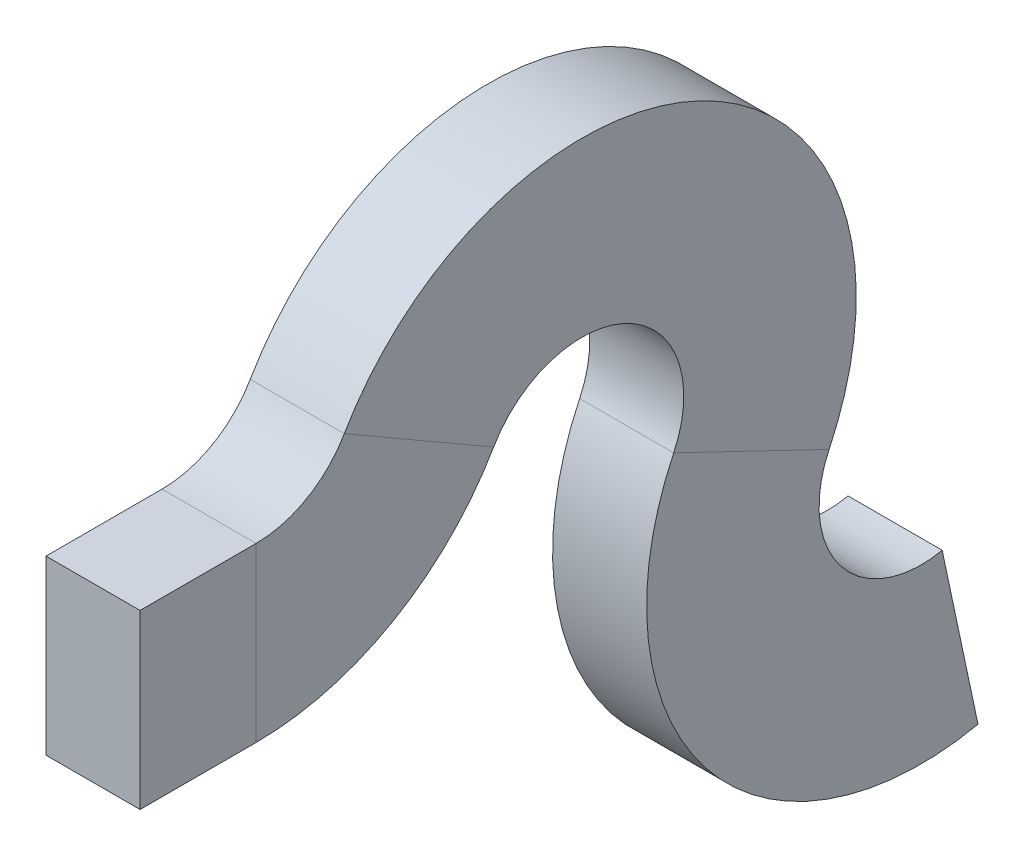
ISO-10303-21;
HEADER;
FILE_DESCRIPTION(('STEP AP214'),'2;1');
FILE_NAME('part.step','',(''),(''),'','','');
FILE_SCHEMA(('AUTOMOTIVE_DESIGN { 1 0 10303 214 1 1 1 1 }'));
ENDSEC;
DATA;
#1=APPLICATION_CONTEXT('core data for automotive mechanical design processes');
#2=APPLICATION_PROTOCOL_DEFINITION('international standard','automotive_design',2000,#1);
#3=PRODUCT_CONTEXT('',#1,'mechanical');
#4=PRODUCT('Part','Part','',(#3));
#5=PRODUCT_RELATED_PRODUCT_CATEGORY('part','',(#4));
#6=PRODUCT_DEFINITION_FORMATION('','',#4);
#7=PRODUCT_DEFINITION_CONTEXT('part definition',#1,'design');
#8=PRODUCT_DEFINITION('design','',#6,#7);
#9=PRODUCT_DEFINITION_SHAPE('','',#8);
#10=(LENGTH_UNIT() NAMED_UNIT(*) SI_UNIT(.MILLI.,.METRE.));
#11=(NAMED_UNIT(*) PLANE_ANGLE_UNIT() SI_UNIT($,.RADIAN.));
#12=(NAMED_UNIT(*) SI_UNIT($,.STERADIAN.) SOLID_ANGLE_UNIT());
#13=UNCERTAINTY_MEASURE_WITH_UNIT(LENGTH_MEASURE(1.E-05),#10,'distance_accuracy_value','');
#14=(GEOMETRIC_REPRESENTATION_CONTEXT(3) GLOBAL_UNCERTAINTY_ASSIGNED_CONTEXT((#13)) GLOBAL_UNIT_ASSIGNED_CONTEXT((#10,
#11,#12)) REPRESENTATION_CONTEXT('',''));
#15=CARTESIAN_POINT('',(0.,0.,0.));
#16=DIRECTION('',(0.,0.,1.));
#17=DIRECTION('',(1.,0.,0.));
#18=AXIS2_PLACEMENT_3D('',#15,#16,#17);
#19=CARTESIAN_POINT('',(0.,0.,0.));
#20=DIRECTION('',(0.,0.,-1.));
#21=DIRECTION('',(-1.,0.,0.));
#22=AXIS2_PLACEMENT_3D('',#19,#20,#21);
#23=PLANE('',#22);
#24=DIRECTION('',(0.,1.,0.));
#25=VECTOR('',#24,1.);
#26=CARTESIAN_POINT('',(15.,-27.5,0.));
#27=LINE('',#26,#25);
#28=CARTESIAN_POINT('',(15.,-27.5,0.));
#29=VERTEX_POINT('',#28);
#30=CARTESIAN_POINT('',(15.,27.5,0.));
#31=VERTEX_POINT('',#30);
#32=EDGE_CURVE('E130',#29,#31,#27,.T.);
#33=ORIENTED_EDGE('',*,*,#32,.T.);
#34=DIRECTION('',(-1.,0.,0.));
#35=VECTOR('',#34,1.);
#36=CARTESIAN_POINT('',(-15.,27.5,0.));
#37=LINE('',#36,#35);
#38=CARTESIAN_POINT('',(-15.,27.5,0.));
#39=VERTEX_POINT('',#38);
#40=EDGE_CURVE('E140',#31,#39,#37,.T.);
#41=ORIENTED_EDGE('',*,*,#40,.T.);
#42=DIRECTION('',(0.,-1.,0.));
#43=VECTOR('',#42,1.);
#44=CARTESIAN_POINT('',(-15.,-27.5,0.));
#45=LINE('',#44,#43);
#46=CARTESIAN_POINT('',(-15.,-27.5,0.));
#47=VERTEX_POINT('',#46);
#48=EDGE_CURVE('E144',#39,#47,#45,.T.);
#49=ORIENTED_EDGE('',*,*,#48,.T.);
#50=DIRECTION('',(1.,0.,0.));
#51=VECTOR('',#50,1.);
#52=CARTESIAN_POINT('',(-15.,-27.5,0.));
#53=LINE('',#52,#51);
#54=EDGE_CURVE('E143',#47,#29,#53,.T.);
#55=ORIENTED_EDGE('',*,*,#54,.T.);
#56=EDGE_LOOP('',(#33,#41,#49,#55));
#57=FACE_BOUND('',#56,.T.);
#58=ADVANCED_FACE('F34',(#57),#23,.F.);
#59=CARTESIAN_POINT('',(0.,-110.688856044028,-261.545796579964));
#60=DIRECTION('',(0.,0.207911690817759,-0.978147600733806));
#61=DIRECTION('',(-1.,0.,0.));
#62=AXIS2_PLACEMENT_3D('',#59,#60,#61);
#63=PLANE('',#62);
#64=DIRECTION('',(0.,0.978147600733806,0.207911690817759));
#65=VECTOR('',#64,1.);
#66=CARTESIAN_POINT('',(15.,-137.587915064208,-267.263368077453));
#67=LINE('',#66,#65);
#68=CARTESIAN_POINT('',(15.,-137.587915064208,-267.263368077453));
#69=VERTEX_POINT('',#68);
#70=CARTESIAN_POINT('',(15.,-83.7897970238487,-255.828225082476));
#71=VERTEX_POINT('',#70);
#72=EDGE_CURVE('E177',#69,#71,#67,.T.);
#73=ORIENTED_EDGE('',*,*,#72,.F.);
#74=DIRECTION('',(1.,0.,0.));
#75=VECTOR('',#74,1.);
#76=CARTESIAN_POINT('',(-15.,-137.587915064208,-267.263368077453));
#77=LINE('',#76,#75);
#78=CARTESIAN_POINT('',(-15.,-137.587915064208,-267.263368077453));
#79=VERTEX_POINT('',#78);
#80=EDGE_CURVE('E11',#79,#69,#77,.T.);
#81=ORIENTED_EDGE('',*,*,#80,.F.);
#82=DIRECTION('',(0.,-0.978147600733806,-0.207911690817759));
#83=VECTOR('',#82,1.);
#84=CARTESIAN_POINT('',(-15.,-137.587915064208,-267.263368077453));
#85=LINE('',#84,#83);
#86=CARTESIAN_POINT('',(-15.,-83.7897970238487,-255.828225082476));
#87=VERTEX_POINT('',#86);
#88=EDGE_CURVE('E48',#87,#79,#85,.T.);
#89=ORIENTED_EDGE('',*,*,#88,.F.);
#90=DIRECTION('',(-1.,0.,0.));
#91=VECTOR('',#90,1.);
#92=CARTESIAN_POINT('',(-15.,-83.7897970238487,-255.828225082476));
#93=LINE('',#92,#91);
#94=EDGE_CURVE('E57',#71,#87,#93,.T.);
#95=ORIENTED_EDGE('',*,*,#94,.F.);
#96=EDGE_LOOP('',(#73,#81,#89,#95));
#97=FACE_BOUND('',#96,.T.);
#98=ADVANCED_FACE('F258',(#97),#63,.T.);
#99=CARTESIAN_POINT('',(15.,-27.5,0.));
#100=DIRECTION('',(-1.,0.,0.));
#101=DIRECTION('',(0.,0.,1.));
#102=AXIS2_PLACEMENT_3D('',#99,#100,#101);
#103=PLANE('',#102);
#104=DIRECTION('',(0.,0.,-1.));
#105=VECTOR('',#104,1.);
#106=CARTESIAN_POINT('',(15.,27.5,0.));
#107=LINE('',#106,#105);
#108=CARTESIAN_POINT('',(15.,27.5,-37.));
#109=VERTEX_POINT('',#108);
#110=EDGE_CURVE('E137',#31,#109,#107,.T.);
#111=ORIENTED_EDGE('',*,*,#110,.F.);
#112=ORIENTED_EDGE('',*,*,#32,.F.);
#113=DIRECTION('',(0.,0.,-1.));
#114=VECTOR('',#113,1.);
#115=CARTESIAN_POINT('',(15.,-27.5,0.));
#116=LINE('',#115,#114);
#117=CARTESIAN_POINT('',(15.,-27.5,-37.));
#118=VERTEX_POINT('',#117);
#119=EDGE_CURVE('E135',#29,#118,#116,.T.);
#120=ORIENTED_EDGE('',*,*,#119,.T.);
#121=DIRECTION('',(0.,1.,0.));
#122=VECTOR('',#121,1.);
#123=CARTESIAN_POINT('',(15.,-27.5,-37.));
#124=LINE('',#123,#122);
#125=EDGE_CURVE('E154',#118,#109,#124,.T.);
#126=ORIENTED_EDGE('',*,*,#125,.T.);
#127=EDGE_LOOP('',(#111,#112,#120,#126));
#128=FACE_BOUND('',#127,.T.);
#129=ADVANCED_FACE('F132',(#128),#103,.F.);
#130=CARTESIAN_POINT('',(-15.,27.5,0.));
#131=DIRECTION('',(0.,-1.,0.));
#132=DIRECTION('',(0.,0.,-1.));
#133=AXIS2_PLACEMENT_3D('',#130,#131,#132);
#134=PLANE('',#133);
#135=DIRECTION('',(0.,0.,-1.));
#136=VECTOR('',#135,1.);
#137=CARTESIAN_POINT('',(-15.,27.5,0.));
#138=LINE('',#137,#136);
#139=CARTESIAN_POINT('',(-15.,27.5,-37.));
#140=VERTEX_POINT('',#139);
#141=EDGE_CURVE('E188',#39,#140,#138,.T.);
#142=ORIENTED_EDGE('',*,*,#141,.F.);
#143=ORIENTED_EDGE('',*,*,#40,.F.);
#144=ORIENTED_EDGE('',*,*,#110,.T.);
#145=DIRECTION('',(-1.,0.,0.));
#146=VECTOR('',#145,1.);
#147=CARTESIAN_POINT('',(-15.,27.5,-37.));
#148=LINE('',#147,#146);
#149=EDGE_CURVE('E185',#109,#140,#148,.T.);
#150=ORIENTED_EDGE('',*,*,#149,.T.);
#151=EDGE_LOOP('',(#142,#143,#144,#150));
#152=FACE_BOUND('',#151,.T.);
#153=ADVANCED_FACE('F265',(#152),#134,.F.);
#154=CARTESIAN_POINT('',(-15.,-27.5,0.));
#155=DIRECTION('',(1.,0.,0.));
#156=DIRECTION('',(0.,0.,-1.));
#157=AXIS2_PLACEMENT_3D('',#154,#155,#156);
#158=PLANE('',#157);
#159=DIRECTION('',(0.,0.,-1.));
#160=VECTOR('',#159,1.);
#161=CARTESIAN_POINT('',(-15.,-27.5,0.));
#162=LINE('',#161,#160);
#163=CARTESIAN_POINT('',(-15.,-27.5,-37.));
#164=VERTEX_POINT('',#163);
#165=EDGE_CURVE('E206',#47,#164,#162,.T.);
#166=ORIENTED_EDGE('',*,*,#165,.F.);
#167=ORIENTED_EDGE('',*,*,#48,.F.);
#168=ORIENTED_EDGE('',*,*,#141,.T.);
#169=DIRECTION('',(0.,-1.,0.));
#170=VECTOR('',#169,1.);
#171=CARTESIAN_POINT('',(-15.,-27.5,-37.));
#172=LINE('',#171,#170);
#173=EDGE_CURVE('E191',#140,#164,#172,.T.);
#174=ORIENTED_EDGE('',*,*,#173,.T.);
#175=EDGE_LOOP('',(#166,#167,#168,#174));
#176=FACE_BOUND('',#175,.T.);
#177=ADVANCED_FACE('F254',(#176),#158,.F.);
#178=CARTESIAN_POINT('',(-15.,-27.5,0.));
#179=DIRECTION('',(0.,1.,0.));
#180=DIRECTION('',(0.,0.,1.));
#181=AXIS2_PLACEMENT_3D('',#178,#179,#180);
#182=PLANE('',#181);
#183=DIRECTION('',(1.,0.,0.));
#184=VECTOR('',#183,1.);
#185=CARTESIAN_POINT('',(-15.,-27.5,-37.));
#186=LINE('',#185,#184);
#187=EDGE_CURVE('E152',#164,#118,#186,.T.);
#188=ORIENTED_EDGE('',*,*,#187,.T.);
#189=ORIENTED_EDGE('',*,*,#119,.F.);
#190=ORIENTED_EDGE('',*,*,#54,.F.);
#191=ORIENTED_EDGE('',*,*,#165,.T.);
#192=EDGE_LOOP('',(#188,#189,#190,#191));
#193=FACE_BOUND('',#192,.T.);
#194=ADVANCED_FACE('F150',(#193),#182,.F.);
#195=CARTESIAN_POINT('',(15.,-27.5,-37.));
#196=DIRECTION('',(-1.,0.,0.));
#197=DIRECTION('',(0.,0.,1.));
#198=AXIS2_PLACEMENT_3D('',#195,#196,#197);
#199=PLANE('',#198);
#200=CARTESIAN_POINT('',(15.,60.,-37.));
#201=DIRECTION('',(1.,0.,0.));
#202=DIRECTION('',(0.,-1.,0.));
#203=AXIS2_PLACEMENT_3D('',#200,#201,#202);
#204=CIRCLE('',#203,32.5);
#205=CARTESIAN_POINT('',(15.,43.75,-65.1458256229943));
#206=VERTEX_POINT('',#205);
#207=EDGE_CURVE('E162',#109,#206,#204,.T.);
#208=ORIENTED_EDGE('',*,*,#207,.F.);
#209=ORIENTED_EDGE('',*,*,#125,.F.);
#210=CARTESIAN_POINT('',(15.,60.,-37.));
#211=DIRECTION('',(1.,0.,0.));
#212=DIRECTION('',(0.,-1.,0.));
#213=AXIS2_PLACEMENT_3D('',#210,#211,#212);
#214=CIRCLE('',#213,87.5);
#215=CARTESIAN_POINT('',(15.,16.25,-112.777222831138));
#216=VERTEX_POINT('',#215);
#217=EDGE_CURVE('E163',#118,#216,#214,.T.);
#218=ORIENTED_EDGE('',*,*,#217,.T.);
#219=DIRECTION('',(0.,0.5,0.866025403784439));
#220=VECTOR('',#219,1.);
#221=CARTESIAN_POINT('',(15.,16.25,-112.777222831138));
#222=LINE('',#221,#220);
#223=EDGE_CURVE('E159',#216,#206,#222,.T.);
#224=ORIENTED_EDGE('',*,*,#223,.T.);
#225=EDGE_LOOP('',(#208,#209,#218,#224));
#226=FACE_BOUND('',#225,.T.);
#227=ADVANCED_FACE('F230',(#226),#199,.F.);
#228=CARTESIAN_POINT('',(0.,60.,-37.));
#229=DIRECTION('',(1.,0.,0.));
#230=DIRECTION('',(0.,0.,-1.));
#231=AXIS2_PLACEMENT_3D('',#228,#229,#230);
#232=CYLINDRICAL_SURFACE('',#231,32.5);
#233=CARTESIAN_POINT('',(-15.,60.,-37.));
#234=DIRECTION('',(1.,0.,0.));
#235=DIRECTION('',(0.,-1.,0.));
#236=AXIS2_PLACEMENT_3D('',#233,#234,#235);
#237=CIRCLE('',#236,32.5);
#238=CARTESIAN_POINT('',(-15.,43.75,-65.1458256229943));
#239=VERTEX_POINT('',#238);
#240=EDGE_CURVE('E194',#140,#239,#237,.T.);
#241=ORIENTED_EDGE('',*,*,#240,.F.);
#242=ORIENTED_EDGE('',*,*,#149,.F.);
#243=ORIENTED_EDGE('',*,*,#207,.T.);
#244=DIRECTION('',(-1.,0.,0.));
#245=VECTOR('',#244,1.);
#246=CARTESIAN_POINT('',(-15.,43.75,-65.1458256229943));
#247=LINE('',#246,#245);
#248=EDGE_CURVE('E166',#206,#239,#247,.T.);
#249=ORIENTED_EDGE('',*,*,#248,.T.);
#250=EDGE_LOOP('',(#241,#242,#243,#249));
#251=FACE_BOUND('',#250,.T.);
#252=ADVANCED_FACE('F271',(#251),#232,.F.);
#253=CARTESIAN_POINT('',(-15.,-27.5,-37.));
#254=DIRECTION('',(1.,0.,0.));
#255=DIRECTION('',(0.,0.,-1.));
#256=AXIS2_PLACEMENT_3D('',#253,#254,#255);
#257=PLANE('',#256);
#258=CARTESIAN_POINT('',(-15.,60.,-37.));
#259=DIRECTION('',(1.,0.,0.));
#260=DIRECTION('',(0.,-1.,0.));
#261=AXIS2_PLACEMENT_3D('',#258,#259,#260);
#262=CIRCLE('',#261,87.5);
#263=CARTESIAN_POINT('',(-15.,16.25,-112.777222831138));
#264=VERTEX_POINT('',#263);
#265=EDGE_CURVE('E210',#164,#264,#262,.T.);
#266=ORIENTED_EDGE('',*,*,#265,.F.);
#267=ORIENTED_EDGE('',*,*,#173,.F.);
#268=ORIENTED_EDGE('',*,*,#240,.T.);
#269=DIRECTION('',(0.,-0.5,-0.866025403784439));
#270=VECTOR('',#269,1.);
#271=CARTESIAN_POINT('',(-15.,16.25,-112.777222831138));
#272=LINE('',#271,#270);
#273=EDGE_CURVE('E197',#239,#264,#272,.T.);
#274=ORIENTED_EDGE('',*,*,#273,.T.);
#275=EDGE_LOOP('',(#266,#267,#268,#274));
#276=FACE_BOUND('',#275,.T.);
#277=ADVANCED_FACE('F235',(#276),#257,.F.);
#278=CARTESIAN_POINT('',(0.,60.,-37.));
#279=DIRECTION('',(1.,0.,0.));
#280=DIRECTION('',(0.,0.,-1.));
#281=AXIS2_PLACEMENT_3D('',#278,#279,#280);
#282=CYLINDRICAL_SURFACE('',#281,87.5);
#283=DIRECTION('',(1.,0.,0.));
#284=VECTOR('',#283,1.);
#285=CARTESIAN_POINT('',(-15.,16.25,-112.777222831138));
#286=LINE('',#285,#284);
#287=EDGE_CURVE('E176',#264,#216,#286,.T.);
#288=ORIENTED_EDGE('',*,*,#287,.T.);
#289=ORIENTED_EDGE('',*,*,#217,.F.);
#290=ORIENTED_EDGE('',*,*,#187,.F.);
#291=ORIENTED_EDGE('',*,*,#265,.T.);
#292=EDGE_LOOP('',(#288,#289,#290,#291));
#293=FACE_BOUND('',#292,.T.);
#294=ADVANCED_FACE('F232',(#293),#282,.T.);
#295=CARTESIAN_POINT('',(15.,16.25,-112.777222831138));
#296=DIRECTION('',(-1.,0.,0.));
#297=DIRECTION('',(0.,0.,1.));
#298=AXIS2_PLACEMENT_3D('',#295,#296,#297);
#299=PLANE('',#298);
#300=CARTESIAN_POINT('',(15.,0.,-140.923048454133));
#301=DIRECTION('',(-1.,0.,0.));
#302=DIRECTION('',(0.,0.5,0.866025403784438));
#303=AXIS2_PLACEMENT_3D('',#300,#301,#302);
#304=CIRCLE('',#303,87.5);
#305=CARTESIAN_POINT('',(15.,-37.9166666666666,-219.780999155941));
#306=VERTEX_POINT('',#305);
#307=EDGE_CURVE('E114',#206,#306,#304,.T.);
#308=ORIENTED_EDGE('',*,*,#307,.F.);
#309=ORIENTED_EDGE('',*,*,#223,.F.);
#310=CARTESIAN_POINT('',(15.,0.,-140.923048454133));
#311=DIRECTION('',(-1.,0.,0.));
#312=DIRECTION('',(0.,0.5,0.866025403784438));
#313=AXIS2_PLACEMENT_3D('',#310,#311,#312);
#314=CIRCLE('',#313,32.5);
#315=CARTESIAN_POINT('',(15.,-14.0833333333333,-170.21314442909));
#316=VERTEX_POINT('',#315);
#317=EDGE_CURVE('E171',#216,#316,#314,.T.);
#318=ORIENTED_EDGE('',*,*,#317,.T.);
#319=DIRECTION('',(0.,-0.433333333333333,-0.901233722306385));
#320=VECTOR('',#319,1.);
#321=CARTESIAN_POINT('',(15.,-14.0833333333333,-170.21314442909));
#322=LINE('',#321,#320);
#323=EDGE_CURVE('E169',#316,#306,#322,.T.);
#324=ORIENTED_EDGE('',*,*,#323,.T.);
#325=EDGE_LOOP('',(#308,#309,#318,#324));
#326=FACE_BOUND('',#325,.T.);
#327=ADVANCED_FACE('F228',(#326),#299,.F.);
#328=CARTESIAN_POINT('',(0.,0.,-140.923048454133));
#329=DIRECTION('',(-1.,0.,0.));
#330=DIRECTION('',(0.,0.,1.));
#331=AXIS2_PLACEMENT_3D('',#328,#329,#330);
#332=CYLINDRICAL_SURFACE('',#331,87.5);
#333=CARTESIAN_POINT('',(-15.,0.,-140.923048454133));
#334=DIRECTION('',(-1.,0.,0.));
#335=DIRECTION('',(0.,0.5,0.866025403784438));
#336=AXIS2_PLACEMENT_3D('',#333,#334,#335);
#337=CIRCLE('',#336,87.5);
#338=CARTESIAN_POINT('',(-15.,-37.9166666666666,-219.780999155941));
#339=VERTEX_POINT('',#338);
#340=EDGE_CURVE('E107',#239,#339,#337,.T.);
#341=ORIENTED_EDGE('',*,*,#340,.F.);
#342=ORIENTED_EDGE('',*,*,#248,.F.);
#343=ORIENTED_EDGE('',*,*,#307,.T.);
#344=DIRECTION('',(-1.,0.,0.));
#345=VECTOR('',#344,1.);
#346=CARTESIAN_POINT('',(-15.,-37.9166666666666,-219.780999155941));
#347=LINE('',#346,#345);
#348=EDGE_CURVE('E173',#306,#339,#347,.T.);
#349=ORIENTED_EDGE('',*,*,#348,.T.);
#350=EDGE_LOOP('',(#341,#342,#343,#349));
#351=FACE_BOUND('',#350,.T.);
#352=ADVANCED_FACE('F268',(#351),#332,.T.);
#353=CARTESIAN_POINT('',(-15.,16.25,-112.777222831138));
#354=DIRECTION('',(1.,0.,0.));
#355=DIRECTION('',(0.,0.,-1.));
#356=AXIS2_PLACEMENT_3D('',#353,#354,#355);
#357=PLANE('',#356);
#358=CARTESIAN_POINT('',(-15.,0.,-140.923048454133));
#359=DIRECTION('',(-1.,0.,0.));
#360=DIRECTION('',(0.,0.5,0.866025403784438));
#361=AXIS2_PLACEMENT_3D('',#358,#359,#360);
#362=CIRCLE('',#361,32.5);
#363=CARTESIAN_POINT('',(-15.,-14.0833333333333,-170.21314442909));
#364=VERTEX_POINT('',#363);
#365=EDGE_CURVE('E215',#264,#364,#362,.T.);
#366=ORIENTED_EDGE('',*,*,#365,.F.);
#367=ORIENTED_EDGE('',*,*,#273,.F.);
#368=ORIENTED_EDGE('',*,*,#340,.T.);
#369=DIRECTION('',(0.,0.433333333333333,0.901233722306385));
#370=VECTOR('',#369,1.);
#371=CARTESIAN_POINT('',(-15.,-14.0833333333333,-170.21314442909));
#372=LINE('',#371,#370);
#373=EDGE_CURVE('E200',#339,#364,#372,.T.);
#374=ORIENTED_EDGE('',*,*,#373,.T.);
#375=EDGE_LOOP('',(#366,#367,#368,#374));
#376=FACE_BOUND('',#375,.T.);
#377=ADVANCED_FACE('F237',(#376),#357,.F.);
#378=CARTESIAN_POINT('',(0.,0.,-140.923048454133));
#379=DIRECTION('',(-1.,0.,0.));
#380=DIRECTION('',(0.,0.,1.));
#381=AXIS2_PLACEMENT_3D('',#378,#379,#380);
#382=CYLINDRICAL_SURFACE('',#381,32.5);
#383=DIRECTION('',(1.,0.,0.));
#384=VECTOR('',#383,1.);
#385=CARTESIAN_POINT('',(-15.,-14.0833333333333,-170.21314442909));
#386=LINE('',#385,#384);
#387=EDGE_CURVE('E183',#364,#316,#386,.T.);
#388=ORIENTED_EDGE('',*,*,#387,.T.);
#389=ORIENTED_EDGE('',*,*,#317,.F.);
#390=ORIENTED_EDGE('',*,*,#287,.F.);
#391=ORIENTED_EDGE('',*,*,#365,.T.);
#392=EDGE_LOOP('',(#388,#389,#390,#391));
#393=FACE_BOUND('',#392,.T.);
#394=ADVANCED_FACE('F224',(#393),#382,.F.);
#395=CARTESIAN_POINT('',(15.,-14.0833333333333,-170.21314442909));
#396=DIRECTION('',(-1.,0.,0.));
#397=DIRECTION('',(0.,0.,1.));
#398=AXIS2_PLACEMENT_3D('',#395,#396,#397);
#399=PLANE('',#398);
#400=CARTESIAN_POINT('',(15.,-52.,-249.071095130899));
#401=DIRECTION('',(1.,0.,0.));
#402=DIRECTION('',(0.,0.433333333333333,0.901233722306385));
#403=AXIS2_PLACEMENT_3D('',#400,#401,#402);
#404=CIRCLE('',#403,32.5);
#405=EDGE_CURVE('E91',#306,#71,#404,.T.);
#406=ORIENTED_EDGE('',*,*,#405,.F.);
#407=ORIENTED_EDGE('',*,*,#323,.F.);
#408=CARTESIAN_POINT('',(15.,-52.,-249.071095130899));
#409=DIRECTION('',(1.,0.,0.));
#410=DIRECTION('',(0.,0.433333333333333,0.901233722306385));
#411=AXIS2_PLACEMENT_3D('',#408,#409,#410);
#412=CIRCLE('',#411,87.5);
#413=EDGE_CURVE('E179',#316,#69,#412,.T.);
#414=ORIENTED_EDGE('',*,*,#413,.T.);
#415=ORIENTED_EDGE('',*,*,#72,.T.);
#416=EDGE_LOOP('',(#406,#407,#414,#415));
#417=FACE_BOUND('',#416,.T.);
#418=ADVANCED_FACE('F227',(#417),#399,.F.);
#419=CARTESIAN_POINT('',(0.,-52.,-249.071095130899));
#420=DIRECTION('',(1.,0.,0.));
#421=DIRECTION('',(0.,0.,-1.));
#422=AXIS2_PLACEMENT_3D('',#419,#420,#421);
#423=CYLINDRICAL_SURFACE('',#422,32.5);
#424=CARTESIAN_POINT('',(-15.,-52.,-249.071095130899));
#425=DIRECTION('',(1.,0.,0.));
#426=DIRECTION('',(0.,0.433333333333333,0.901233722306385));
#427=AXIS2_PLACEMENT_3D('',#424,#425,#426);
#428=CIRCLE('',#427,32.5);
#429=EDGE_CURVE('E86',#339,#87,#428,.T.);
#430=ORIENTED_EDGE('',*,*,#429,.F.);
#431=ORIENTED_EDGE('',*,*,#348,.F.);
#432=ORIENTED_EDGE('',*,*,#405,.T.);
#433=ORIENTED_EDGE('',*,*,#94,.T.);
#434=EDGE_LOOP('',(#430,#431,#432,#433));
#435=FACE_BOUND('',#434,.T.);
#436=ADVANCED_FACE('F241',(#435),#423,.F.);
#437=CARTESIAN_POINT('',(-15.,-14.0833333333333,-170.21314442909));
#438=DIRECTION('',(1.,0.,0.));
#439=DIRECTION('',(0.,0.,-1.));
#440=AXIS2_PLACEMENT_3D('',#437,#438,#439);
#441=PLANE('',#440);
#442=CARTESIAN_POINT('',(-15.,-52.,-249.071095130899));
#443=DIRECTION('',(1.,0.,0.));
#444=DIRECTION('',(0.,0.433333333333333,0.901233722306385));
#445=AXIS2_PLACEMENT_3D('',#442,#443,#444);
#446=CIRCLE('',#445,87.5);
#447=EDGE_CURVE('E41',#364,#79,#446,.T.);
#448=ORIENTED_EDGE('',*,*,#447,.F.);
#449=ORIENTED_EDGE('',*,*,#373,.F.);
#450=ORIENTED_EDGE('',*,*,#429,.T.);
#451=ORIENTED_EDGE('',*,*,#88,.T.);
#452=EDGE_LOOP('',(#448,#449,#450,#451));
#453=FACE_BOUND('',#452,.T.);
#454=ADVANCED_FACE('F238',(#453),#441,.F.);
#455=CARTESIAN_POINT('',(0.,-52.,-249.071095130899));
#456=DIRECTION('',(1.,0.,0.));
#457=DIRECTION('',(0.,0.,-1.));
#458=AXIS2_PLACEMENT_3D('',#455,#456,#457);
#459=CYLINDRICAL_SURFACE('',#458,87.5);
#460=ORIENTED_EDGE('',*,*,#80,.T.);
#461=ORIENTED_EDGE('',*,*,#413,.F.);
#462=ORIENTED_EDGE('',*,*,#387,.F.);
#463=ORIENTED_EDGE('',*,*,#447,.T.);
#464=EDGE_LOOP('',(#460,#461,#462,#463));
#465=FACE_BOUND('',#464,.T.);
#466=ADVANCED_FACE('F240',(#465),#459,.T.);
#467=CLOSED_SHELL('',(#58,#98,#129,#153,#177,#194,#227,#252,#277,#294,#327,#352,#377,#394,#418,
#436,#454,#466));
#468=MANIFOLD_SOLID_BREP('B2',#467);
#469=ADVANCED_BREP_SHAPE_REPRESENTATION('',(#18,#468),#14);
#470=SHAPE_DEFINITION_REPRESENTATION(#9,#469);
ENDSEC;
END-ISO-10303-21;
